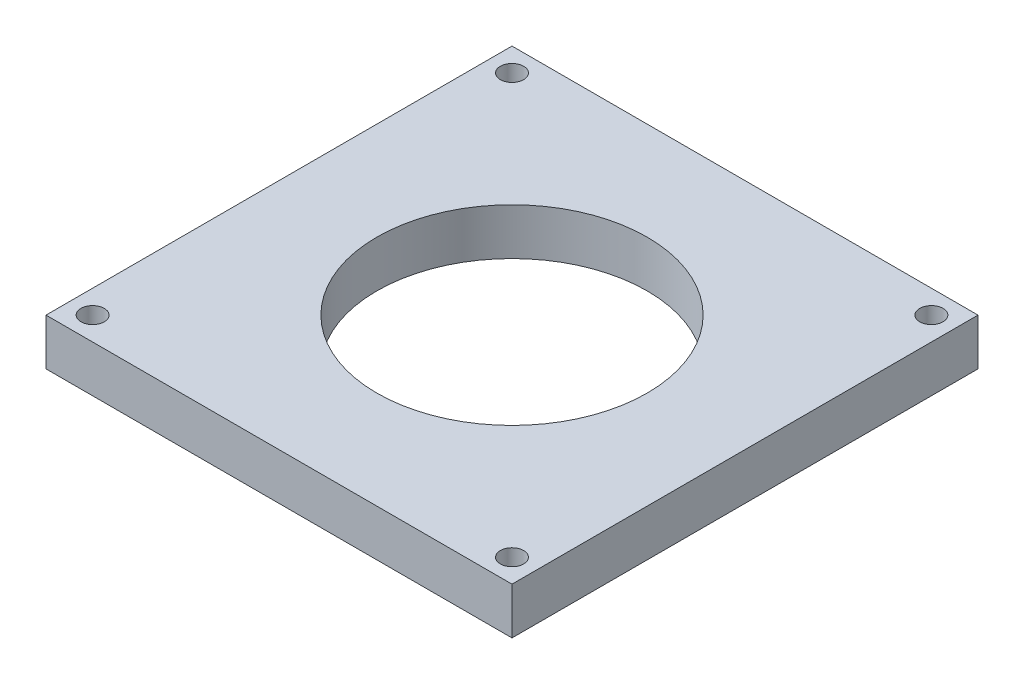
ISO-10303-21;
HEADER;
FILE_DESCRIPTION(('STEP AP214'),'2;1');
FILE_NAME('part.step','',(''),(''),'','','');
FILE_SCHEMA(('AUTOMOTIVE_DESIGN { 1 0 10303 214 1 1 1 1 }'));
ENDSEC;
DATA;
#1=APPLICATION_CONTEXT('core data for automotive mechanical design processes');
#2=APPLICATION_PROTOCOL_DEFINITION('international standard','automotive_design',2000,#1);
#3=PRODUCT_CONTEXT('',#1,'mechanical');
#4=PRODUCT('Part','Part','',(#3));
#5=PRODUCT_RELATED_PRODUCT_CATEGORY('part','',(#4));
#6=PRODUCT_DEFINITION_FORMATION('','',#4);
#7=PRODUCT_DEFINITION_CONTEXT('part definition',#1,'design');
#8=PRODUCT_DEFINITION('design','',#6,#7);
#9=PRODUCT_DEFINITION_SHAPE('','',#8);
#10=(LENGTH_UNIT() NAMED_UNIT(*) SI_UNIT(.MILLI.,.METRE.));
#11=(NAMED_UNIT(*) PLANE_ANGLE_UNIT() SI_UNIT($,.RADIAN.));
#12=(NAMED_UNIT(*) SI_UNIT($,.STERADIAN.) SOLID_ANGLE_UNIT());
#13=UNCERTAINTY_MEASURE_WITH_UNIT(LENGTH_MEASURE(1.E-05),#10,'distance_accuracy_value','');
#14=(GEOMETRIC_REPRESENTATION_CONTEXT(3) GLOBAL_UNCERTAINTY_ASSIGNED_CONTEXT((#13)) GLOBAL_UNIT_ASSIGNED_CONTEXT((#10,
#11,#12)) REPRESENTATION_CONTEXT('',''));
#15=CARTESIAN_POINT('',(0.,0.,0.));
#16=DIRECTION('',(0.,0.,1.));
#17=DIRECTION('',(1.,0.,0.));
#18=AXIS2_PLACEMENT_3D('',#15,#16,#17);
#19=CARTESIAN_POINT('',(0.,2.54,0.));
#20=DIRECTION('',(0.,-1.,0.));
#21=DIRECTION('',(0.,0.,-1.));
#22=AXIS2_PLACEMENT_3D('',#19,#20,#21);
#23=PLANE('',#22);
#24=DIRECTION('',(0.,0.,-1.));
#25=VECTOR('',#24,1.);
#26=CARTESIAN_POINT('',(12.7,2.54,12.7));
#27=LINE('',#26,#25);
#28=CARTESIAN_POINT('',(12.7,2.54,12.7));
#29=VERTEX_POINT('',#28);
#30=CARTESIAN_POINT('',(12.7,2.54,-12.7));
#31=VERTEX_POINT('',#30);
#32=EDGE_CURVE('E89',#29,#31,#27,.T.);
#33=ORIENTED_EDGE('',*,*,#32,.T.);
#34=DIRECTION('',(-1.,0.,0.));
#35=VECTOR('',#34,1.);
#36=CARTESIAN_POINT('',(-12.7,2.54,-12.7));
#37=LINE('',#36,#35);
#38=CARTESIAN_POINT('',(-12.7,2.54,-12.7));
#39=VERTEX_POINT('',#38);
#40=EDGE_CURVE('E84',#31,#39,#37,.T.);
#41=ORIENTED_EDGE('',*,*,#40,.T.);
#42=DIRECTION('',(0.,0.,1.));
#43=VECTOR('',#42,1.);
#44=CARTESIAN_POINT('',(-12.7,2.54,12.7));
#45=LINE('',#44,#43);
#46=CARTESIAN_POINT('',(-12.7,2.54,12.7));
#47=VERTEX_POINT('',#46);
#48=EDGE_CURVE('E87',#39,#47,#45,.T.);
#49=ORIENTED_EDGE('',*,*,#48,.T.);
#50=DIRECTION('',(1.,0.,0.));
#51=VECTOR('',#50,1.);
#52=CARTESIAN_POINT('',(-12.7,2.54,12.7));
#53=LINE('',#52,#51);
#54=EDGE_CURVE('E54',#47,#29,#53,.T.);
#55=ORIENTED_EDGE('',*,*,#54,.T.);
#56=EDGE_LOOP('',(#33,#41,#49,#55));
#57=FACE_BOUND('',#56,.T.);
#58=CARTESIAN_POINT('',(0.,2.54,0.));
#59=DIRECTION('',(0.,1.,0.));
#60=DIRECTION('',(0.,0.,1.));
#61=AXIS2_PLACEMENT_3D('',#58,#59,#60);
#62=CIRCLE('',#61,7.366);
#63=CARTESIAN_POINT('',(0.,2.54,7.366));
#64=VERTEX_POINT('',#63);
#65=EDGE_CURVE('E104',#64,#64,#62,.T.);
#66=ORIENTED_EDGE('',*,*,#65,.F.);
#67=EDGE_LOOP('',(#66));
#68=FACE_BOUND('',#67,.T.);
#69=CARTESIAN_POINT('',(11.43,2.54,-11.43));
#70=DIRECTION('',(0.,1.,0.));
#71=DIRECTION('',(0.,0.,1.));
#72=AXIS2_PLACEMENT_3D('',#69,#70,#71);
#73=CIRCLE('',#72,0.635000000000001);
#74=CARTESIAN_POINT('',(11.43,2.54,-10.795));
#75=VERTEX_POINT('',#74);
#76=EDGE_CURVE('E119',#75,#75,#73,.T.);
#77=ORIENTED_EDGE('',*,*,#76,.F.);
#78=EDGE_LOOP('',(#77));
#79=FACE_BOUND('',#78,.T.);
#80=CARTESIAN_POINT('',(11.43,2.54,11.43));
#81=DIRECTION('',(0.,1.,0.));
#82=DIRECTION('',(0.,0.,1.));
#83=AXIS2_PLACEMENT_3D('',#80,#81,#82);
#84=CIRCLE('',#83,0.635000000000001);
#85=CARTESIAN_POINT('',(11.43,2.54,12.065));
#86=VERTEX_POINT('',#85);
#87=EDGE_CURVE('E125',#86,#86,#84,.T.);
#88=ORIENTED_EDGE('',*,*,#87,.F.);
#89=EDGE_LOOP('',(#88));
#90=FACE_BOUND('',#89,.T.);
#91=CARTESIAN_POINT('',(-11.43,2.54,11.43));
#92=DIRECTION('',(0.,1.,0.));
#93=DIRECTION('',(0.,0.,1.));
#94=AXIS2_PLACEMENT_3D('',#91,#92,#93);
#95=CIRCLE('',#94,0.635000000000001);
#96=CARTESIAN_POINT('',(-11.43,2.54,12.065));
#97=VERTEX_POINT('',#96);
#98=EDGE_CURVE('E131',#97,#97,#95,.T.);
#99=ORIENTED_EDGE('',*,*,#98,.F.);
#100=EDGE_LOOP('',(#99));
#101=FACE_BOUND('',#100,.T.);
#102=CARTESIAN_POINT('',(-11.43,2.54,-11.43));
#103=DIRECTION('',(0.,1.,0.));
#104=DIRECTION('',(0.,0.,1.));
#105=AXIS2_PLACEMENT_3D('',#102,#103,#104);
#106=CIRCLE('',#105,0.635000000000001);
#107=CARTESIAN_POINT('',(-11.43,2.54,-10.795));
#108=VERTEX_POINT('',#107);
#109=EDGE_CURVE('E137',#108,#108,#106,.T.);
#110=ORIENTED_EDGE('',*,*,#109,.F.);
#111=EDGE_LOOP('',(#110));
#112=FACE_BOUND('',#111,.T.);
#113=ADVANCED_FACE('F37',(#57,#68,#79,#90,#101,#112),#23,.F.);
#114=CARTESIAN_POINT('',(0.,0.,0.));
#115=DIRECTION('',(0.,-1.,0.));
#116=DIRECTION('',(0.,0.,-1.));
#117=AXIS2_PLACEMENT_3D('',#114,#115,#116);
#118=PLANE('',#117);
#119=CARTESIAN_POINT('',(-11.43,0.,11.43));
#120=DIRECTION('',(0.,1.,0.));
#121=DIRECTION('',(0.,0.,1.));
#122=AXIS2_PLACEMENT_3D('',#119,#120,#121);
#123=CIRCLE('',#122,0.635000000000001);
#124=CARTESIAN_POINT('',(-11.43,0.,12.065));
#125=VERTEX_POINT('',#124);
#126=EDGE_CURVE('E134',#125,#125,#123,.T.);
#127=ORIENTED_EDGE('',*,*,#126,.T.);
#128=EDGE_LOOP('',(#127));
#129=FACE_BOUND('',#128,.T.);
#130=CARTESIAN_POINT('',(11.43,0.,-11.43));
#131=DIRECTION('',(0.,1.,0.));
#132=DIRECTION('',(0.,0.,1.));
#133=AXIS2_PLACEMENT_3D('',#130,#131,#132);
#134=CIRCLE('',#133,0.635000000000001);
#135=CARTESIAN_POINT('',(11.43,0.,-10.795));
#136=VERTEX_POINT('',#135);
#137=EDGE_CURVE('E122',#136,#136,#134,.T.);
#138=ORIENTED_EDGE('',*,*,#137,.T.);
#139=EDGE_LOOP('',(#138));
#140=FACE_BOUND('',#139,.T.);
#141=DIRECTION('',(0.,0.,-1.));
#142=VECTOR('',#141,1.);
#143=CARTESIAN_POINT('',(12.7,0.,12.7));
#144=LINE('',#143,#142);
#145=CARTESIAN_POINT('',(12.7,0.,12.7));
#146=VERTEX_POINT('',#145);
#147=CARTESIAN_POINT('',(12.7,0.,-12.7));
#148=VERTEX_POINT('',#147);
#149=EDGE_CURVE('E101',#146,#148,#144,.T.);
#150=ORIENTED_EDGE('',*,*,#149,.F.);
#151=DIRECTION('',(1.,0.,0.));
#152=VECTOR('',#151,1.);
#153=CARTESIAN_POINT('',(-12.7,0.,12.7));
#154=LINE('',#153,#152);
#155=CARTESIAN_POINT('',(-12.7,0.,12.7));
#156=VERTEX_POINT('',#155);
#157=EDGE_CURVE('E77',#156,#146,#154,.T.);
#158=ORIENTED_EDGE('',*,*,#157,.F.);
#159=DIRECTION('',(0.,0.,1.));
#160=VECTOR('',#159,1.);
#161=CARTESIAN_POINT('',(-12.7,0.,12.7));
#162=LINE('',#161,#160);
#163=CARTESIAN_POINT('',(-12.7,0.,-12.7));
#164=VERTEX_POINT('',#163);
#165=EDGE_CURVE('E71',#164,#156,#162,.T.);
#166=ORIENTED_EDGE('',*,*,#165,.F.);
#167=DIRECTION('',(-1.,0.,0.));
#168=VECTOR('',#167,1.);
#169=CARTESIAN_POINT('',(-12.7,0.,-12.7));
#170=LINE('',#169,#168);
#171=EDGE_CURVE('E93',#148,#164,#170,.T.);
#172=ORIENTED_EDGE('',*,*,#171,.F.);
#173=EDGE_LOOP('',(#150,#158,#166,#172));
#174=FACE_BOUND('',#173,.T.);
#175=CARTESIAN_POINT('',(0.,0.,0.));
#176=DIRECTION('',(0.,1.,0.));
#177=DIRECTION('',(0.,0.,1.));
#178=AXIS2_PLACEMENT_3D('',#175,#176,#177);
#179=CIRCLE('',#178,7.366);
#180=CARTESIAN_POINT('',(0.,0.,7.366));
#181=VERTEX_POINT('',#180);
#182=EDGE_CURVE('E116',#181,#181,#179,.T.);
#183=ORIENTED_EDGE('',*,*,#182,.T.);
#184=EDGE_LOOP('',(#183));
#185=FACE_BOUND('',#184,.T.);
#186=CARTESIAN_POINT('',(11.43,0.,11.43));
#187=DIRECTION('',(0.,1.,0.));
#188=DIRECTION('',(0.,0.,1.));
#189=AXIS2_PLACEMENT_3D('',#186,#187,#188);
#190=CIRCLE('',#189,0.635000000000001);
#191=CARTESIAN_POINT('',(11.43,0.,12.065));
#192=VERTEX_POINT('',#191);
#193=EDGE_CURVE('E128',#192,#192,#190,.T.);
#194=ORIENTED_EDGE('',*,*,#193,.T.);
#195=EDGE_LOOP('',(#194));
#196=FACE_BOUND('',#195,.T.);
#197=CARTESIAN_POINT('',(-11.43,0.,-11.43));
#198=DIRECTION('',(0.,1.,0.));
#199=DIRECTION('',(0.,0.,1.));
#200=AXIS2_PLACEMENT_3D('',#197,#198,#199);
#201=CIRCLE('',#200,0.635000000000001);
#202=CARTESIAN_POINT('',(-11.43,0.,-10.795));
#203=VERTEX_POINT('',#202);
#204=EDGE_CURVE('E140',#203,#203,#201,.T.);
#205=ORIENTED_EDGE('',*,*,#204,.T.);
#206=EDGE_LOOP('',(#205));
#207=FACE_BOUND('',#206,.T.);
#208=ADVANCED_FACE('F112',(#129,#140,#174,#185,#196,#207),#118,.T.);
#209=CARTESIAN_POINT('',(12.7,2.54,12.7));
#210=DIRECTION('',(-1.,0.,0.));
#211=DIRECTION('',(0.,0.,1.));
#212=AXIS2_PLACEMENT_3D('',#209,#210,#211);
#213=PLANE('',#212);
#214=ORIENTED_EDGE('',*,*,#149,.T.);
#215=DIRECTION('',(0.,-1.,0.));
#216=VECTOR('',#215,1.);
#217=CARTESIAN_POINT('',(12.7,2.54,-12.7));
#218=LINE('',#217,#216);
#219=EDGE_CURVE('E11',#31,#148,#218,.T.);
#220=ORIENTED_EDGE('',*,*,#219,.F.);
#221=ORIENTED_EDGE('',*,*,#32,.F.);
#222=DIRECTION('',(0.,-1.,0.));
#223=VECTOR('',#222,1.);
#224=CARTESIAN_POINT('',(12.7,2.54,12.7));
#225=LINE('',#224,#223);
#226=EDGE_CURVE('E97',#29,#146,#225,.T.);
#227=ORIENTED_EDGE('',*,*,#226,.T.);
#228=EDGE_LOOP('',(#214,#220,#221,#227));
#229=FACE_BOUND('',#228,.T.);
#230=ADVANCED_FACE('F39',(#229),#213,.F.);
#231=CARTESIAN_POINT('',(-12.7,2.54,-12.7));
#232=DIRECTION('',(0.,0.,1.));
#233=DIRECTION('',(1.,0.,0.));
#234=AXIS2_PLACEMENT_3D('',#231,#232,#233);
#235=PLANE('',#234);
#236=ORIENTED_EDGE('',*,*,#171,.T.);
#237=DIRECTION('',(0.,-1.,0.));
#238=VECTOR('',#237,1.);
#239=CARTESIAN_POINT('',(-12.7,2.54,-12.7));
#240=LINE('',#239,#238);
#241=EDGE_CURVE('E46',#39,#164,#240,.T.);
#242=ORIENTED_EDGE('',*,*,#241,.F.);
#243=ORIENTED_EDGE('',*,*,#40,.F.);
#244=ORIENTED_EDGE('',*,*,#219,.T.);
#245=EDGE_LOOP('',(#236,#242,#243,#244));
#246=FACE_BOUND('',#245,.T.);
#247=ADVANCED_FACE('F92',(#246),#235,.F.);
#248=CARTESIAN_POINT('',(-12.7,2.54,12.7));
#249=DIRECTION('',(1.,0.,0.));
#250=DIRECTION('',(0.,0.,-1.));
#251=AXIS2_PLACEMENT_3D('',#248,#249,#250);
#252=PLANE('',#251);
#253=ORIENTED_EDGE('',*,*,#165,.T.);
#254=DIRECTION('',(0.,-1.,0.));
#255=VECTOR('',#254,1.);
#256=CARTESIAN_POINT('',(-12.7,2.54,12.7));
#257=LINE('',#256,#255);
#258=EDGE_CURVE('E94',#47,#156,#257,.T.);
#259=ORIENTED_EDGE('',*,*,#258,.F.);
#260=ORIENTED_EDGE('',*,*,#48,.F.);
#261=ORIENTED_EDGE('',*,*,#241,.T.);
#262=EDGE_LOOP('',(#253,#259,#260,#261));
#263=FACE_BOUND('',#262,.T.);
#264=ADVANCED_FACE('F95',(#263),#252,.F.);
#265=CARTESIAN_POINT('',(-12.7,2.54,12.7));
#266=DIRECTION('',(0.,0.,-1.));
#267=DIRECTION('',(-1.,0.,0.));
#268=AXIS2_PLACEMENT_3D('',#265,#266,#267);
#269=PLANE('',#268);
#270=ORIENTED_EDGE('',*,*,#157,.T.);
#271=ORIENTED_EDGE('',*,*,#226,.F.);
#272=ORIENTED_EDGE('',*,*,#54,.F.);
#273=ORIENTED_EDGE('',*,*,#258,.T.);
#274=EDGE_LOOP('',(#270,#271,#272,#273));
#275=FACE_BOUND('',#274,.T.);
#276=ADVANCED_FACE('F109',(#275),#269,.F.);
#277=CARTESIAN_POINT('',(0.,2.54,0.));
#278=DIRECTION('',(0.,-1.,0.));
#279=DIRECTION('',(0.,0.,-1.));
#280=AXIS2_PLACEMENT_3D('',#277,#278,#279);
#281=CYLINDRICAL_SURFACE('',#280,7.366);
#282=ORIENTED_EDGE('',*,*,#65,.T.);
#283=EDGE_LOOP('',(#282));
#284=FACE_BOUND('',#283,.T.);
#285=ORIENTED_EDGE('',*,*,#182,.F.);
#286=EDGE_LOOP('',(#285));
#287=FACE_BOUND('',#286,.T.);
#288=ADVANCED_FACE('F157',(#284,#287),#281,.F.);
#289=CARTESIAN_POINT('',(11.43,2.54,-11.43));
#290=DIRECTION('',(0.,-1.,0.));
#291=DIRECTION('',(0.,0.,-1.));
#292=AXIS2_PLACEMENT_3D('',#289,#290,#291);
#293=CYLINDRICAL_SURFACE('',#292,0.635000000000001);
#294=ORIENTED_EDGE('',*,*,#76,.T.);
#295=EDGE_LOOP('',(#294));
#296=FACE_BOUND('',#295,.T.);
#297=ORIENTED_EDGE('',*,*,#137,.F.);
#298=EDGE_LOOP('',(#297));
#299=FACE_BOUND('',#298,.T.);
#300=ADVANCED_FACE('F211',(#296,#299),#293,.F.);
#301=CARTESIAN_POINT('',(11.43,2.54,11.43));
#302=DIRECTION('',(0.,-1.,0.));
#303=DIRECTION('',(0.,0.,-1.));
#304=AXIS2_PLACEMENT_3D('',#301,#302,#303);
#305=CYLINDRICAL_SURFACE('',#304,0.635000000000001);
#306=ORIENTED_EDGE('',*,*,#87,.T.);
#307=EDGE_LOOP('',(#306));
#308=FACE_BOUND('',#307,.T.);
#309=ORIENTED_EDGE('',*,*,#193,.F.);
#310=EDGE_LOOP('',(#309));
#311=FACE_BOUND('',#310,.T.);
#312=ADVANCED_FACE('F220',(#308,#311),#305,.F.);
#313=CARTESIAN_POINT('',(-11.43,2.54,11.43));
#314=DIRECTION('',(0.,-1.,0.));
#315=DIRECTION('',(0.,0.,-1.));
#316=AXIS2_PLACEMENT_3D('',#313,#314,#315);
#317=CYLINDRICAL_SURFACE('',#316,0.635000000000001);
#318=ORIENTED_EDGE('',*,*,#98,.T.);
#319=EDGE_LOOP('',(#318));
#320=FACE_BOUND('',#319,.T.);
#321=ORIENTED_EDGE('',*,*,#126,.F.);
#322=EDGE_LOOP('',(#321));
#323=FACE_BOUND('',#322,.T.);
#324=ADVANCED_FACE('F229',(#320,#323),#317,.F.);
#325=CARTESIAN_POINT('',(-11.43,2.54,-11.43));
#326=DIRECTION('',(0.,-1.,0.));
#327=DIRECTION('',(0.,0.,-1.));
#328=AXIS2_PLACEMENT_3D('',#325,#326,#327);
#329=CYLINDRICAL_SURFACE('',#328,0.635000000000001);
#330=ORIENTED_EDGE('',*,*,#109,.T.);
#331=EDGE_LOOP('',(#330));
#332=FACE_BOUND('',#331,.T.);
#333=ORIENTED_EDGE('',*,*,#204,.F.);
#334=EDGE_LOOP('',(#333));
#335=FACE_BOUND('',#334,.T.);
#336=ADVANCED_FACE('F146',(#332,#335),#329,.F.);
#337=CLOSED_SHELL('',(#113,#208,#230,#247,#264,#276,#288,#300,#312,#324,#336));
#338=MANIFOLD_SOLID_BREP('B2',#337);
#339=ADVANCED_BREP_SHAPE_REPRESENTATION('',(#18,#338),#14);
#340=SHAPE_DEFINITION_REPRESENTATION(#9,#339);
ENDSEC;
END-ISO-10303-21;
